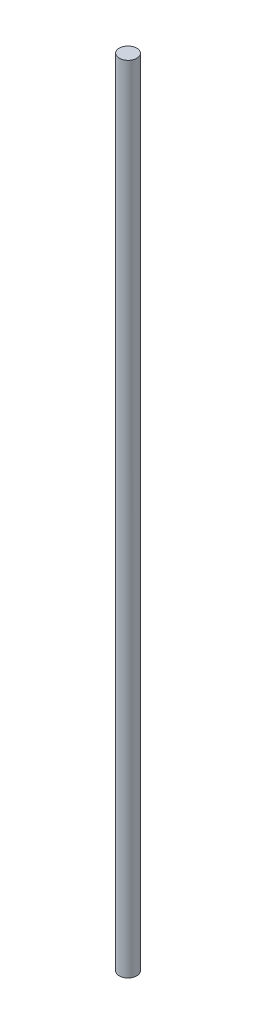
ISO-10303-21;
HEADER;
FILE_DESCRIPTION(('STEP AP214'),'2;1');
FILE_NAME('part.step','',(''),(''),'','','');
FILE_SCHEMA(('AUTOMOTIVE_DESIGN { 1 0 10303 214 1 1 1 1 }'));
ENDSEC;
DATA;
#1=APPLICATION_CONTEXT('core data for automotive mechanical design processes');
#2=APPLICATION_PROTOCOL_DEFINITION('international standard','automotive_design',2000,#1);
#3=PRODUCT_CONTEXT('',#1,'mechanical');
#4=PRODUCT('Part','Part','',(#3));
#5=PRODUCT_RELATED_PRODUCT_CATEGORY('part','',(#4));
#6=PRODUCT_DEFINITION_FORMATION('','',#4);
#7=PRODUCT_DEFINITION_CONTEXT('part definition',#1,'design');
#8=PRODUCT_DEFINITION('design','',#6,#7);
#9=PRODUCT_DEFINITION_SHAPE('','',#8);
#10=(LENGTH_UNIT() NAMED_UNIT(*) SI_UNIT(.MILLI.,.METRE.));
#11=(NAMED_UNIT(*) PLANE_ANGLE_UNIT() SI_UNIT($,.RADIAN.));
#12=(NAMED_UNIT(*) SI_UNIT($,.STERADIAN.) SOLID_ANGLE_UNIT());
#13=UNCERTAINTY_MEASURE_WITH_UNIT(LENGTH_MEASURE(1.E-05),#10,'distance_accuracy_value','');
#14=(GEOMETRIC_REPRESENTATION_CONTEXT(3) GLOBAL_UNCERTAINTY_ASSIGNED_CONTEXT((#13)) GLOBAL_UNIT_ASSIGNED_CONTEXT((#10,
#11,#12)) REPRESENTATION_CONTEXT('',''));
#15=CARTESIAN_POINT('',(0.,0.,0.));
#16=DIRECTION('',(0.,0.,1.));
#17=DIRECTION('',(1.,0.,0.));
#18=AXIS2_PLACEMENT_3D('',#15,#16,#17);
#19=CARTESIAN_POINT('',(0.,0.,0.));
#20=DIRECTION('',(0.,1.,0.));
#21=DIRECTION('',(0.,0.,1.));
#22=AXIS2_PLACEMENT_3D('',#19,#20,#21);
#23=PLANE('',#22);
#24=CARTESIAN_POINT('',(0.,0.,0.));
#25=DIRECTION('',(0.,1.,0.));
#26=DIRECTION('',(0.,0.,1.));
#27=AXIS2_PLACEMENT_3D('',#24,#25,#26);
#28=CIRCLE('',#27,4.);
#29=CARTESIAN_POINT('',(0.,0.,4.));
#30=VERTEX_POINT('',#29);
#31=EDGE_CURVE('E42',#30,#30,#28,.T.);
#32=ORIENTED_EDGE('',*,*,#31,.F.);
#33=EDGE_LOOP('',(#32));
#34=FACE_BOUND('',#33,.T.);
#35=ADVANCED_FACE('F35',(#34),#23,.F.);
#36=CARTESIAN_POINT('',(0.,373.313708498985,0.));
#37=DIRECTION('',(0.,-1.,0.));
#38=DIRECTION('',(0.,0.,-1.));
#39=AXIS2_PLACEMENT_3D('',#36,#37,#38);
#40=CYLINDRICAL_SURFACE('',#39,4.);
#41=CARTESIAN_POINT('',(0.,362.,0.));
#42=DIRECTION('',(0.,-1.,0.));
#43=DIRECTION('',(0.,0.,-1.));
#44=AXIS2_PLACEMENT_3D('',#41,#42,#43);
#45=CIRCLE('',#44,4.);
#46=CARTESIAN_POINT('',(0.,362.,-4.));
#47=VERTEX_POINT('',#46);
#48=EDGE_CURVE('E10',#47,#47,#45,.T.);
#49=ORIENTED_EDGE('',*,*,#48,.T.);
#50=EDGE_LOOP('',(#49));
#51=FACE_BOUND('',#50,.T.);
#52=ORIENTED_EDGE('',*,*,#31,.T.);
#53=EDGE_LOOP('',(#52));
#54=FACE_BOUND('',#53,.T.);
#55=ADVANCED_FACE('F37',(#51,#54),#40,.T.);
#56=CARTESIAN_POINT('',(-13.8641453348391,362.,2.82231715695899));
#57=DIRECTION('',(0.,-1.,0.));
#58=DIRECTION('',(-0.850120758174352,0.,-0.526587786148773));
#59=AXIS2_PLACEMENT_3D('',#56,#57,#58);
#60=PLANE('',#59);
#61=ORIENTED_EDGE('',*,*,#48,.F.);
#62=EDGE_LOOP('',(#61));
#63=FACE_BOUND('',#62,.T.);
#64=ADVANCED_FACE('F53',(#63),#60,.F.);
#65=CLOSED_SHELL('',(#35,#55,#64));
#66=MANIFOLD_SOLID_BREP('B2',#65);
#67=ADVANCED_BREP_SHAPE_REPRESENTATION('',(#18,#66),#14);
#68=SHAPE_DEFINITION_REPRESENTATION(#9,#67);
ENDSEC;
END-ISO-10303-21;
